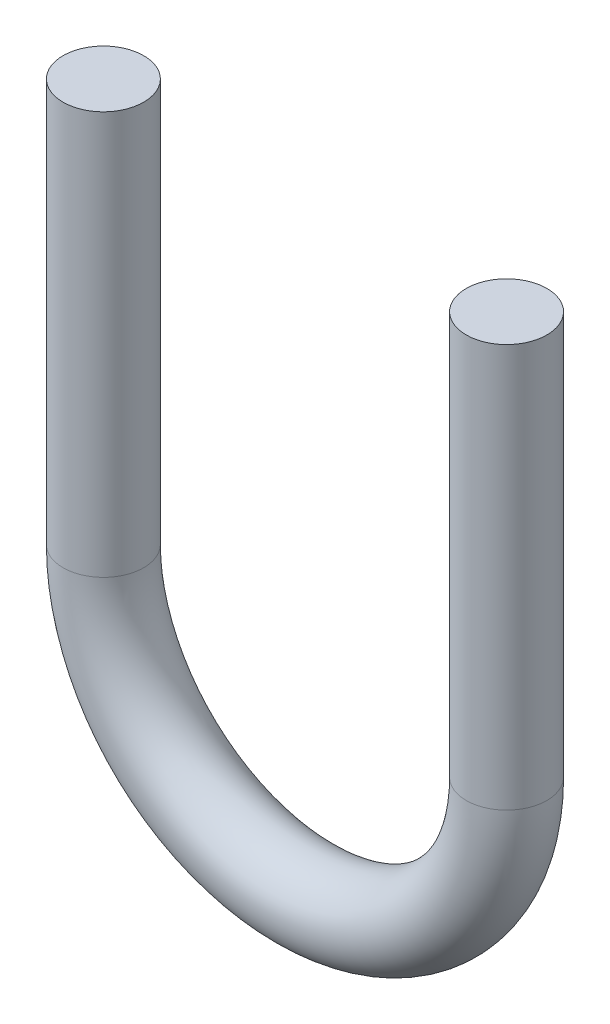
ISO-10303-21;
HEADER;
FILE_DESCRIPTION(('STEP AP214'),'2;1');
FILE_NAME('part.step','',(''),(''),'','','');
FILE_SCHEMA(('AUTOMOTIVE_DESIGN { 1 0 10303 214 1 1 1 1 }'));
ENDSEC;
DATA;
#1=APPLICATION_CONTEXT('core data for automotive mechanical design processes');
#2=APPLICATION_PROTOCOL_DEFINITION('international standard','automotive_design',2000,#1);
#3=PRODUCT_CONTEXT('',#1,'mechanical');
#4=PRODUCT('Part','Part','',(#3));
#5=PRODUCT_RELATED_PRODUCT_CATEGORY('part','',(#4));
#6=PRODUCT_DEFINITION_FORMATION('','',#4);
#7=PRODUCT_DEFINITION_CONTEXT('part definition',#1,'design');
#8=PRODUCT_DEFINITION('design','',#6,#7);
#9=PRODUCT_DEFINITION_SHAPE('','',#8);
#10=(LENGTH_UNIT() NAMED_UNIT(*) SI_UNIT(.MILLI.,.METRE.));
#11=(NAMED_UNIT(*) PLANE_ANGLE_UNIT() SI_UNIT($,.RADIAN.));
#12=(NAMED_UNIT(*) SI_UNIT($,.STERADIAN.) SOLID_ANGLE_UNIT());
#13=UNCERTAINTY_MEASURE_WITH_UNIT(LENGTH_MEASURE(1.E-05),#10,'distance_accuracy_value','');
#14=(GEOMETRIC_REPRESENTATION_CONTEXT(3) GLOBAL_UNCERTAINTY_ASSIGNED_CONTEXT((#13)) GLOBAL_UNIT_ASSIGNED_CONTEXT((#10,
#11,#12)) REPRESENTATION_CONTEXT('',''));
#15=CARTESIAN_POINT('',(0.,0.,0.));
#16=DIRECTION('',(0.,0.,1.));
#17=DIRECTION('',(1.,0.,0.));
#18=AXIS2_PLACEMENT_3D('',#15,#16,#17);
#19=CARTESIAN_POINT('',(15.875,0.,0.));
#20=DIRECTION('',(0.,1.,0.));
#21=DIRECTION('',(0.,0.,1.));
#22=AXIS2_PLACEMENT_3D('',#19,#20,#21);
#23=CYLINDRICAL_SURFACE('',#22,3.175);
#24=CARTESIAN_POINT('',(15.875,0.,0.));
#25=DIRECTION('',(0.,-1.,0.));
#26=DIRECTION('',(0.,0.,1.));
#27=AXIS2_PLACEMENT_3D('',#24,#25,#26);
#28=CIRCLE('',#27,3.175);
#29=CARTESIAN_POINT('',(19.05,0.,0.));
#30=VERTEX_POINT('',#29);
#31=EDGE_CURVE('E36',#30,#30,#28,.T.);
#32=ORIENTED_EDGE('',*,*,#31,.F.);
#33=EDGE_LOOP('',(#32));
#34=FACE_BOUND('',#33,.T.);
#35=CARTESIAN_POINT('',(15.875,31.75,0.));
#36=DIRECTION('',(0.,-1.,0.));
#37=DIRECTION('',(0.,0.,1.));
#38=AXIS2_PLACEMENT_3D('',#35,#36,#37);
#39=CIRCLE('',#38,3.175);
#40=CARTESIAN_POINT('',(15.875,31.75,3.175));
#41=VERTEX_POINT('',#40);
#42=EDGE_CURVE('E10',#41,#41,#39,.T.);
#43=ORIENTED_EDGE('',*,*,#42,.T.);
#44=EDGE_LOOP('',(#43));
#45=FACE_BOUND('',#44,.T.);
#46=ADVANCED_FACE('F30',(#34,#45),#23,.T.);
#47=CARTESIAN_POINT('',(0.,0.,0.));
#48=DIRECTION('',(0.,0.,1.));
#49=DIRECTION('',(1.,0.,0.));
#50=AXIS2_PLACEMENT_3D('',#47,#48,#49);
#51=TOROIDAL_SURFACE('',#50,15.875,3.175);
#52=CARTESIAN_POINT('',(-15.875,0.,0.));
#53=DIRECTION('',(0.,1.,0.));
#54=DIRECTION('',(0.,0.,1.));
#55=AXIS2_PLACEMENT_3D('',#52,#53,#54);
#56=CIRCLE('',#55,3.175);
#57=CARTESIAN_POINT('',(-19.05,0.,0.));
#58=VERTEX_POINT('',#57);
#59=EDGE_CURVE('E40',#58,#58,#56,.T.);
#60=CARTESIAN_POINT('',(0.,0.,0.));
#61=DIRECTION('',(0.,0.,1.));
#62=DIRECTION('',(1.,0.,0.));
#63=AXIS2_PLACEMENT_3D('',#60,#61,#62);
#64=CIRCLE('',#63,19.05);
#65=EDGE_CURVE('',#58,#30,#64,.T.);
#66=ORIENTED_EDGE('',*,*,#59,.F.);
#67=ORIENTED_EDGE('',*,*,#31,.T.);
#68=ORIENTED_EDGE('',*,*,#65,.T.);
#69=ORIENTED_EDGE('',*,*,#65,.F.);
#70=EDGE_LOOP('',(#66,#68,#67,#69));
#71=FACE_BOUND('',#70,.T.);
#72=ADVANCED_FACE('F55',(#71),#51,.T.);
#73=CARTESIAN_POINT('',(-15.875,0.,0.));
#74=DIRECTION('',(0.,1.,0.));
#75=DIRECTION('',(0.,0.,1.));
#76=AXIS2_PLACEMENT_3D('',#73,#74,#75);
#77=CYLINDRICAL_SURFACE('',#76,3.175);
#78=ORIENTED_EDGE('',*,*,#59,.T.);
#79=EDGE_LOOP('',(#78));
#80=FACE_BOUND('',#79,.T.);
#81=CARTESIAN_POINT('',(-15.875,31.75,0.));
#82=DIRECTION('',(0.,1.,0.));
#83=DIRECTION('',(0.,0.,1.));
#84=AXIS2_PLACEMENT_3D('',#81,#82,#83);
#85=CIRCLE('',#84,3.175);
#86=CARTESIAN_POINT('',(-15.875,31.75,3.175));
#87=VERTEX_POINT('',#86);
#88=EDGE_CURVE('E44',#87,#87,#85,.T.);
#89=ORIENTED_EDGE('',*,*,#88,.F.);
#90=EDGE_LOOP('',(#89));
#91=FACE_BOUND('',#90,.T.);
#92=ADVANCED_FACE('F52',(#80,#91),#77,.T.);
#93=CARTESIAN_POINT('',(15.875,31.75,0.));
#94=DIRECTION('',(0.,-1.,0.));
#95=DIRECTION('',(0.,0.,1.));
#96=AXIS2_PLACEMENT_3D('',#93,#94,#95);
#97=PLANE('',#96);
#98=ORIENTED_EDGE('',*,*,#42,.F.);
#99=EDGE_LOOP('',(#98));
#100=FACE_BOUND('',#99,.T.);
#101=ADVANCED_FACE('F54',(#100),#97,.F.);
#102=CARTESIAN_POINT('',(-15.875,31.75,0.));
#103=DIRECTION('',(0.,1.,0.));
#104=DIRECTION('',(0.,0.,1.));
#105=AXIS2_PLACEMENT_3D('',#102,#103,#104);
#106=PLANE('',#105);
#107=ORIENTED_EDGE('',*,*,#88,.T.);
#108=EDGE_LOOP('',(#107));
#109=FACE_BOUND('',#108,.T.);
#110=ADVANCED_FACE('F50',(#109),#106,.T.);
#111=CLOSED_SHELL('',(#46,#72,#92,#101,#110));
#112=MANIFOLD_SOLID_BREP('B2',#111);
#113=ADVANCED_BREP_SHAPE_REPRESENTATION('',(#18,#112),#14);
#114=SHAPE_DEFINITION_REPRESENTATION(#9,#113);
ENDSEC;
END-ISO-10303-21;
